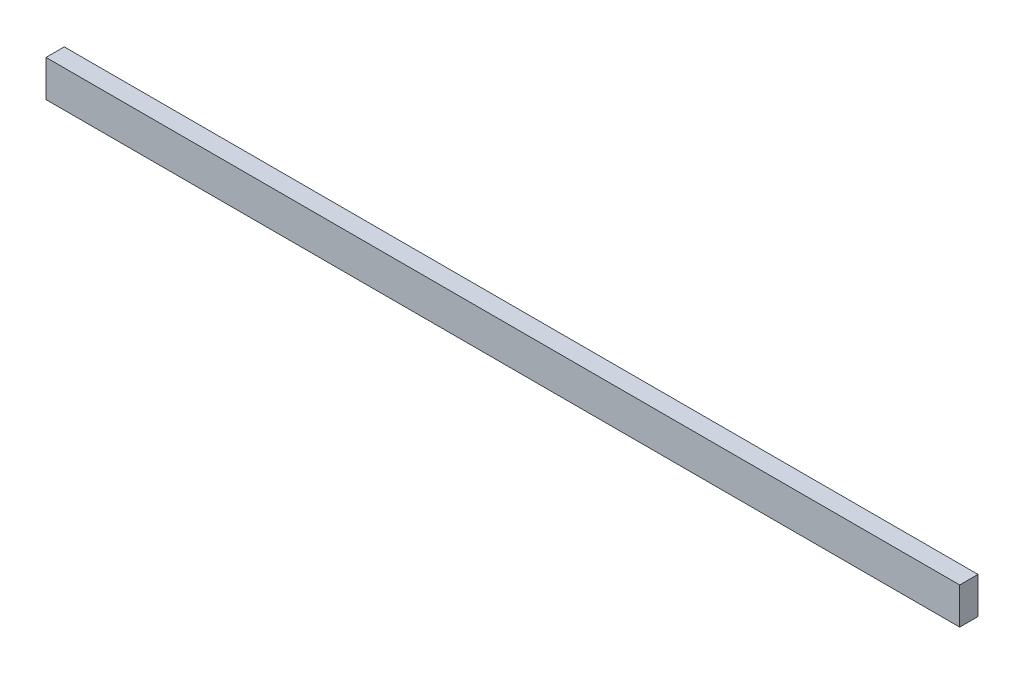
ISO-10303-21;
HEADER;
FILE_DESCRIPTION(('STEP AP214'),'2;1');
FILE_NAME('part.step','',(''),(''),'','','');
FILE_SCHEMA(('AUTOMOTIVE_DESIGN { 1 0 10303 214 1 1 1 1 }'));
ENDSEC;
DATA;
#1=APPLICATION_CONTEXT('core data for automotive mechanical design processes');
#2=APPLICATION_PROTOCOL_DEFINITION('international standard','automotive_design',2000,#1);
#3=PRODUCT_CONTEXT('',#1,'mechanical');
#4=PRODUCT('Part','Part','',(#3));
#5=PRODUCT_RELATED_PRODUCT_CATEGORY('part','',(#4));
#6=PRODUCT_DEFINITION_FORMATION('','',#4);
#7=PRODUCT_DEFINITION_CONTEXT('part definition',#1,'design');
#8=PRODUCT_DEFINITION('design','',#6,#7);
#9=PRODUCT_DEFINITION_SHAPE('','',#8);
#10=(LENGTH_UNIT() NAMED_UNIT(*) SI_UNIT(.MILLI.,.METRE.));
#11=(NAMED_UNIT(*) PLANE_ANGLE_UNIT() SI_UNIT($,.RADIAN.));
#12=(NAMED_UNIT(*) SI_UNIT($,.STERADIAN.) SOLID_ANGLE_UNIT());
#13=UNCERTAINTY_MEASURE_WITH_UNIT(LENGTH_MEASURE(1.E-05),#10,'distance_accuracy_value','');
#14=(GEOMETRIC_REPRESENTATION_CONTEXT(3) GLOBAL_UNCERTAINTY_ASSIGNED_CONTEXT((#13)) GLOBAL_UNIT_ASSIGNED_CONTEXT((#10,
#11,#12)) REPRESENTATION_CONTEXT('',''));
#15=CARTESIAN_POINT('',(0.,0.,0.));
#16=DIRECTION('',(0.,0.,1.));
#17=DIRECTION('',(1.,0.,0.));
#18=AXIS2_PLACEMENT_3D('',#15,#16,#17);
#19=CARTESIAN_POINT('',(0.,0.,100.));
#20=DIRECTION('',(1.,0.,0.));
#21=DIRECTION('',(0.,1.,0.));
#22=AXIS2_PLACEMENT_3D('',#19,#20,#21);
#23=PLANE('',#22);
#24=DIRECTION('',(0.,-1.,0.));
#25=VECTOR('',#24,1.);
#26=CARTESIAN_POINT('',(0.,0.,0.));
#27=LINE('',#26,#25);
#28=CARTESIAN_POINT('',(0.,0.,0.));
#29=VERTEX_POINT('',#28);
#30=CARTESIAN_POINT('',(0.,-200.,0.));
#31=VERTEX_POINT('',#30);
#32=EDGE_CURVE('E111',#29,#31,#27,.T.);
#33=ORIENTED_EDGE('',*,*,#32,.T.);
#34=DIRECTION('',(0.,0.,-1.));
#35=VECTOR('',#34,1.);
#36=CARTESIAN_POINT('',(0.,-200.,100.));
#37=LINE('',#36,#35);
#38=CARTESIAN_POINT('',(0.,-200.,100.));
#39=VERTEX_POINT('',#38);
#40=EDGE_CURVE('E11',#39,#31,#37,.T.);
#41=ORIENTED_EDGE('',*,*,#40,.F.);
#42=DIRECTION('',(0.,-1.,0.));
#43=VECTOR('',#42,1.);
#44=CARTESIAN_POINT('',(0.,0.,100.));
#45=LINE('',#44,#43);
#46=CARTESIAN_POINT('',(0.,0.,100.));
#47=VERTEX_POINT('',#46);
#48=EDGE_CURVE('E95',#47,#39,#45,.T.);
#49=ORIENTED_EDGE('',*,*,#48,.F.);
#50=DIRECTION('',(0.,0.,-1.));
#51=VECTOR('',#50,1.);
#52=CARTESIAN_POINT('',(0.,0.,100.));
#53=LINE('',#52,#51);
#54=EDGE_CURVE('E107',#47,#29,#53,.T.);
#55=ORIENTED_EDGE('',*,*,#54,.T.);
#56=EDGE_LOOP('',(#33,#41,#49,#55));
#57=FACE_BOUND('',#56,.T.);
#58=ADVANCED_FACE('F43',(#57),#23,.F.);
#59=CARTESIAN_POINT('',(0.,-200.,100.));
#60=DIRECTION('',(0.,1.,0.));
#61=DIRECTION('',(0.,0.,1.));
#62=AXIS2_PLACEMENT_3D('',#59,#60,#61);
#63=PLANE('',#62);
#64=DIRECTION('',(1.,0.,0.));
#65=VECTOR('',#64,1.);
#66=CARTESIAN_POINT('',(0.,-200.,0.));
#67=LINE('',#66,#65);
#68=CARTESIAN_POINT('',(5000.,-200.,0.));
#69=VERTEX_POINT('',#68);
#70=EDGE_CURVE('E100',#31,#69,#67,.T.);
#71=ORIENTED_EDGE('',*,*,#70,.T.);
#72=DIRECTION('',(0.,0.,-1.));
#73=VECTOR('',#72,1.);
#74=CARTESIAN_POINT('',(5000.,-200.,100.));
#75=LINE('',#74,#73);
#76=CARTESIAN_POINT('',(5000.,-200.,100.));
#77=VERTEX_POINT('',#76);
#78=EDGE_CURVE('E52',#77,#69,#75,.T.);
#79=ORIENTED_EDGE('',*,*,#78,.F.);
#80=DIRECTION('',(1.,0.,0.));
#81=VECTOR('',#80,1.);
#82=CARTESIAN_POINT('',(0.,-200.,100.));
#83=LINE('',#82,#81);
#84=EDGE_CURVE('E90',#39,#77,#83,.T.);
#85=ORIENTED_EDGE('',*,*,#84,.F.);
#86=ORIENTED_EDGE('',*,*,#40,.T.);
#87=EDGE_LOOP('',(#71,#79,#85,#86));
#88=FACE_BOUND('',#87,.T.);
#89=ADVANCED_FACE('F99',(#88),#63,.F.);
#90=CARTESIAN_POINT('',(5000.,0.,100.));
#91=DIRECTION('',(-1.,0.,0.));
#92=DIRECTION('',(0.,0.,1.));
#93=AXIS2_PLACEMENT_3D('',#90,#91,#92);
#94=PLANE('',#93);
#95=DIRECTION('',(0.,1.,0.));
#96=VECTOR('',#95,1.);
#97=CARTESIAN_POINT('',(5000.,0.,0.));
#98=LINE('',#97,#96);
#99=CARTESIAN_POINT('',(5000.,0.,0.));
#100=VERTEX_POINT('',#99);
#101=EDGE_CURVE('E77',#69,#100,#98,.T.);
#102=ORIENTED_EDGE('',*,*,#101,.T.);
#103=DIRECTION('',(0.,0.,-1.));
#104=VECTOR('',#103,1.);
#105=CARTESIAN_POINT('',(5000.,0.,100.));
#106=LINE('',#105,#104);
#107=CARTESIAN_POINT('',(5000.,0.,100.));
#108=VERTEX_POINT('',#107);
#109=EDGE_CURVE('E102',#108,#100,#106,.T.);
#110=ORIENTED_EDGE('',*,*,#109,.F.);
#111=DIRECTION('',(0.,1.,0.));
#112=VECTOR('',#111,1.);
#113=CARTESIAN_POINT('',(5000.,0.,100.));
#114=LINE('',#113,#112);
#115=EDGE_CURVE('E93',#77,#108,#114,.T.);
#116=ORIENTED_EDGE('',*,*,#115,.F.);
#117=ORIENTED_EDGE('',*,*,#78,.T.);
#118=EDGE_LOOP('',(#102,#110,#116,#117));
#119=FACE_BOUND('',#118,.T.);
#120=ADVANCED_FACE('F103',(#119),#94,.F.);
#121=CARTESIAN_POINT('',(0.,0.,100.));
#122=DIRECTION('',(0.,-1.,0.));
#123=DIRECTION('',(0.,0.,-1.));
#124=AXIS2_PLACEMENT_3D('',#121,#122,#123);
#125=PLANE('',#124);
#126=DIRECTION('',(-1.,0.,0.));
#127=VECTOR('',#126,1.);
#128=CARTESIAN_POINT('',(0.,0.,0.));
#129=LINE('',#128,#127);
#130=EDGE_CURVE('E83',#100,#29,#129,.T.);
#131=ORIENTED_EDGE('',*,*,#130,.T.);
#132=ORIENTED_EDGE('',*,*,#54,.F.);
#133=DIRECTION('',(-1.,0.,0.));
#134=VECTOR('',#133,1.);
#135=CARTESIAN_POINT('',(0.,0.,100.));
#136=LINE('',#135,#134);
#137=EDGE_CURVE('E60',#108,#47,#136,.T.);
#138=ORIENTED_EDGE('',*,*,#137,.F.);
#139=ORIENTED_EDGE('',*,*,#109,.T.);
#140=EDGE_LOOP('',(#131,#132,#138,#139));
#141=FACE_BOUND('',#140,.T.);
#142=ADVANCED_FACE('F124',(#141),#125,.F.);
#143=CARTESIAN_POINT('',(0.,0.,100.));
#144=DIRECTION('',(0.,0.,1.));
#145=DIRECTION('',(1.,0.,0.));
#146=AXIS2_PLACEMENT_3D('',#143,#144,#145);
#147=PLANE('',#146);
#148=ORIENTED_EDGE('',*,*,#48,.T.);
#149=ORIENTED_EDGE('',*,*,#84,.T.);
#150=ORIENTED_EDGE('',*,*,#115,.T.);
#151=ORIENTED_EDGE('',*,*,#137,.T.);
#152=EDGE_LOOP('',(#148,#149,#150,#151));
#153=FACE_BOUND('',#152,.T.);
#154=ADVANCED_FACE('F91',(#153),#147,.T.);
#155=CARTESIAN_POINT('',(0.,0.,0.));
#156=DIRECTION('',(0.,0.,1.));
#157=DIRECTION('',(1.,0.,0.));
#158=AXIS2_PLACEMENT_3D('',#155,#156,#157);
#159=PLANE('',#158);
#160=ORIENTED_EDGE('',*,*,#32,.F.);
#161=ORIENTED_EDGE('',*,*,#130,.F.);
#162=ORIENTED_EDGE('',*,*,#101,.F.);
#163=ORIENTED_EDGE('',*,*,#70,.F.);
#164=EDGE_LOOP('',(#160,#161,#162,#163));
#165=FACE_BOUND('',#164,.T.);
#166=ADVANCED_FACE('F127',(#165),#159,.F.);
#167=CLOSED_SHELL('',(#58,#89,#120,#142,#154,#166));
#168=MANIFOLD_SOLID_BREP('B2',#167);
#169=ADVANCED_BREP_SHAPE_REPRESENTATION('',(#18,#168),#14);
#170=SHAPE_DEFINITION_REPRESENTATION(#9,#169);
ENDSEC;
END-ISO-10303-21;
